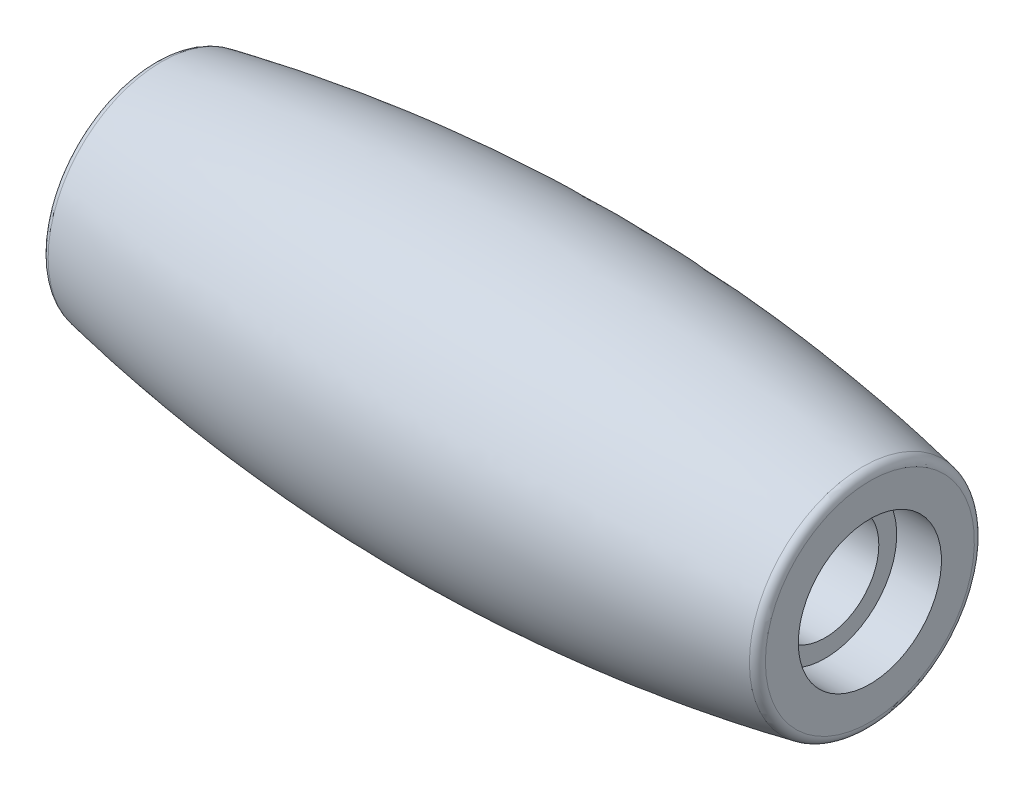
ISO-10303-21;
HEADER;
FILE_DESCRIPTION(('STEP AP214'),'2;1');
FILE_NAME('part.step','',(''),(''),'','','');
FILE_SCHEMA(('AUTOMOTIVE_DESIGN { 1 0 10303 214 1 1 1 1 }'));
ENDSEC;
DATA;
#1=APPLICATION_CONTEXT('core data for automotive mechanical design processes');
#2=APPLICATION_PROTOCOL_DEFINITION('international standard','automotive_design',2000,#1);
#3=PRODUCT_CONTEXT('',#1,'mechanical');
#4=PRODUCT('Part','Part','',(#3));
#5=PRODUCT_RELATED_PRODUCT_CATEGORY('part','',(#4));
#6=PRODUCT_DEFINITION_FORMATION('','',#4);
#7=PRODUCT_DEFINITION_CONTEXT('part definition',#1,'design');
#8=PRODUCT_DEFINITION('design','',#6,#7);
#9=PRODUCT_DEFINITION_SHAPE('','',#8);
#10=(LENGTH_UNIT() NAMED_UNIT(*) SI_UNIT(.MILLI.,.METRE.));
#11=(NAMED_UNIT(*) PLANE_ANGLE_UNIT() SI_UNIT($,.RADIAN.));
#12=(NAMED_UNIT(*) SI_UNIT($,.STERADIAN.) SOLID_ANGLE_UNIT());
#13=UNCERTAINTY_MEASURE_WITH_UNIT(LENGTH_MEASURE(1.E-05),#10,'distance_accuracy_value','');
#14=(GEOMETRIC_REPRESENTATION_CONTEXT(3) GLOBAL_UNCERTAINTY_ASSIGNED_CONTEXT((#13)) GLOBAL_UNIT_ASSIGNED_CONTEXT((#10,
#11,#12)) REPRESENTATION_CONTEXT('',''));
#15=CARTESIAN_POINT('',(0.,0.,0.));
#16=DIRECTION('',(0.,0.,1.));
#17=DIRECTION('',(1.,0.,0.));
#18=AXIS2_PLACEMENT_3D('',#15,#16,#17);
#19=CARTESIAN_POINT('',(-39.1940298507463,0.,12.6611163272422));
#20=CARTESIAN_POINT('',(-39.1940298507463,-12.6611163272422,12.6611163272422));
#21=CARTESIAN_POINT('',(-39.1940298507463,-12.6611163272422,0.));
#22=CARTESIAN_POINT('',(-39.1940298507463,-12.6611163272422,-12.6611163272422));
#23=CARTESIAN_POINT('',(-39.1940298507463,0.,-12.6611163272422));
#24=CARTESIAN_POINT('',(-39.1940298507463,12.6611163272422,-12.6611163272422));
#25=CARTESIAN_POINT('',(-39.1940298507463,12.6611163272422,0.));
#26=CARTESIAN_POINT('',(-39.1940298507463,12.6611163272422,12.6611163272422));
#27=CARTESIAN_POINT('',(-39.1940298507463,0.,12.6611163272422));
#28=CARTESIAN_POINT('',(0.,0.,20.4132525909699));
#29=CARTESIAN_POINT('',(0.,-20.4132525909699,20.4132525909699));
#30=CARTESIAN_POINT('',(0.,-20.4132525909699,0.));
#31=CARTESIAN_POINT('',(0.,-20.4132525909699,-20.4132525909699));
#32=CARTESIAN_POINT('',(0.,0.,-20.4132525909699));
#33=CARTESIAN_POINT('',(0.,20.4132525909699,-20.4132525909699));
#34=CARTESIAN_POINT('',(0.,20.4132525909699,0.));
#35=CARTESIAN_POINT('',(0.,20.4132525909699,20.4132525909699));
#36=CARTESIAN_POINT('',(0.,0.,20.4132525909699));
#37=CARTESIAN_POINT('',(39.1940298507463,0.,12.6611163272422));
#38=CARTESIAN_POINT('',(39.1940298507463,-12.6611163272422,12.6611163272422));
#39=CARTESIAN_POINT('',(39.1940298507463,-12.6611163272422,0.));
#40=CARTESIAN_POINT('',(39.1940298507463,-12.6611163272422,-12.6611163272422));
#41=CARTESIAN_POINT('',(39.1940298507463,0.,-12.6611163272422));
#42=CARTESIAN_POINT('',(39.1940298507463,12.6611163272422,-12.6611163272422));
#43=CARTESIAN_POINT('',(39.1940298507463,12.6611163272422,0.));
#44=CARTESIAN_POINT('',(39.1940298507463,12.6611163272422,12.6611163272422));
#45=CARTESIAN_POINT('',(39.1940298507463,0.,12.6611163272422));
#46=(BOUNDED_SURFACE() B_SPLINE_SURFACE(2,2,((#19,#20,#21,#22,#23,#24,#25,#26,#27),(#28,#29,#30,
#31,#32,#33,#34,#35,#36),(#37,#38,#39,#40,#41,#42,#43,#44,#45)),.UNSPECIFIED.,.F.,.T.,
.F.) B_SPLINE_SURFACE_WITH_KNOTS((3,3),(3,2,2,2,3),(-0.195268409757262,0.195268409757262),
(-3.14159265358979,-1.5707963267949,0.,1.5707963267949,3.14159265358979),
.UNSPECIFIED.) GEOMETRIC_REPRESENTATION_ITEM() RATIONAL_B_SPLINE_SURFACE(((1.,0.707106781186548,
1.,0.707106781186548,1.,0.707106781186548,1.,0.707106781186548,1.),(0.980995625382391,
0.693668659022227,0.980995625382391,0.693668659022227,0.980995625382391,0.693668659022227,
0.980995625382391,0.693668659022227,0.980995625382391),(1.,0.707106781186548,1.,
0.707106781186548,1.,0.707106781186548,1.,0.707106781186548,1.))) REPRESENTATION_ITEM('') SURFACE());
#47=CARTESIAN_POINT('',(39.1940298507463,0.,0.));
#48=DIRECTION('',(-1.,0.,0.));
#49=DIRECTION('',(0.,-1.,0.));
#50=AXIS2_PLACEMENT_3D('',#47,#48,#49);
#51=CIRCLE('',#50,12.6611163272422);
#52=CARTESIAN_POINT('',(39.1940298507463,12.6611163272422,0.));
#53=VERTEX_POINT('',#52);
#54=CARTESIAN_POINT('',(39.1940298507463,0.,12.6611163272422));
#55=VERTEX_POINT('',#54);
#56=EDGE_CURVE('E124',#53,#55,#51,.T.);
#57=CARTESIAN_POINT('',(0.,0.,-185.5));
#58=DIRECTION('',(0.,-1.,0.));
#59=DIRECTION('',(0.,0.,1.));
#60=AXIS2_PLACEMENT_3D('',#57,#58,#59);
#61=CIRCLE('',#60,202.);
#62=CARTESIAN_POINT('',(-39.1940298507463,0.,12.6611163272422));
#63=VERTEX_POINT('',#62);
#64=EDGE_CURVE('E11',#55,#63,#61,.T.);
#65=CARTESIAN_POINT('',(-39.1940298507463,0.,0.));
#66=DIRECTION('',(-1.,0.,0.));
#67=DIRECTION('',(0.,-1.,0.));
#68=AXIS2_PLACEMENT_3D('',#65,#66,#67);
#69=CIRCLE('',#68,12.6611163272422);
#70=CARTESIAN_POINT('',(-39.1940298507463,12.6611163272422,0.));
#71=VERTEX_POINT('',#70);
#72=EDGE_CURVE('E159',#71,#63,#69,.T.);
#73=CARTESIAN_POINT('',(-39.1940298507463,0.,0.));
#74=DIRECTION('',(-1.,0.,0.));
#75=DIRECTION('',(0.,-1.,0.));
#76=AXIS2_PLACEMENT_3D('',#73,#74,#75);
#77=CIRCLE('',#76,12.6611163272422);
#78=EDGE_CURVE('E30',#63,#71,#77,.T.);
#79=CARTESIAN_POINT('',(39.1940298507463,0.,0.));
#80=DIRECTION('',(-1.,0.,0.));
#81=DIRECTION('',(0.,-1.,0.));
#82=AXIS2_PLACEMENT_3D('',#79,#80,#81);
#83=CIRCLE('',#82,12.6611163272422);
#84=EDGE_CURVE('E80',#55,#53,#83,.T.);
#85=ORIENTED_EDGE('',*,*,#56,.T.);
#86=ORIENTED_EDGE('',*,*,#64,.T.);
#87=ORIENTED_EDGE('',*,*,#72,.F.);
#88=ORIENTED_EDGE('',*,*,#78,.F.);
#89=ORIENTED_EDGE('',*,*,#64,.F.);
#90=ORIENTED_EDGE('',*,*,#84,.T.);
#91=EDGE_LOOP('',(#85,#86,#87,#88,#89,#90));
#92=FACE_BOUND('',#91,.T.);
#93=ADVANCED_FACE('F19',(#92),#46,.F.);
#94=CARTESIAN_POINT('',(-40.,12.5,0.));
#95=DIRECTION('',(-1.,0.,0.));
#96=DIRECTION('',(0.,0.,1.));
#97=AXIS2_PLACEMENT_3D('',#94,#95,#96);
#98=PLANE('',#97);
#99=CARTESIAN_POINT('',(-40.,0.,0.));
#100=DIRECTION('',(1.,0.,0.));
#101=DIRECTION('',(0.,0.,-1.));
#102=AXIS2_PLACEMENT_3D('',#99,#100,#101);
#103=CIRCLE('',#102,8.);
#104=CARTESIAN_POINT('',(-40.,0.,8.));
#105=VERTEX_POINT('',#104);
#106=EDGE_CURVE('E107',#105,#105,#103,.T.);
#107=ORIENTED_EDGE('',*,*,#106,.T.);
#108=EDGE_LOOP('',(#107));
#109=FACE_BOUND('',#108,.T.);
#110=CARTESIAN_POINT('',(-40.,0.,0.));
#111=DIRECTION('',(1.,0.,0.));
#112=DIRECTION('',(0.,-1.,0.));
#113=AXIS2_PLACEMENT_3D('',#110,#111,#112);
#114=CIRCLE('',#113,11.6801207018598);
#115=CARTESIAN_POINT('',(-40.,11.6801207018598,0.));
#116=VERTEX_POINT('',#115);
#117=CARTESIAN_POINT('',(-40.,0.,11.6801207018598));
#118=VERTEX_POINT('',#117);
#119=EDGE_CURVE('E43',#116,#118,#114,.T.);
#120=ORIENTED_EDGE('',*,*,#119,.F.);
#121=CARTESIAN_POINT('',(-40.,0.,0.));
#122=DIRECTION('',(1.,0.,0.));
#123=DIRECTION('',(0.,-1.,0.));
#124=AXIS2_PLACEMENT_3D('',#121,#122,#123);
#125=CIRCLE('',#124,11.6801207018598);
#126=EDGE_CURVE('E166',#118,#116,#125,.T.);
#127=ORIENTED_EDGE('',*,*,#126,.F.);
#128=EDGE_LOOP('',(#120,#127));
#129=FACE_BOUND('',#128,.T.);
#130=ADVANCED_FACE('F111',(#109,#129),#98,.T.);
#131=CARTESIAN_POINT('',(-39.,0.,0.));
#132=DIRECTION('',(1.,0.,0.));
#133=DIRECTION('',(0.,0.,-1.));
#134=AXIS2_PLACEMENT_3D('',#131,#132,#133);
#135=TOROIDAL_SURFACE('',#134,11.6801207018598,1.);
#136=ORIENTED_EDGE('',*,*,#72,.T.);
#137=CARTESIAN_POINT('',(-39.,0.,11.6801207018598));
#138=DIRECTION('',(0.,-1.,0.));
#139=DIRECTION('',(0.,0.,1.));
#140=AXIS2_PLACEMENT_3D('',#137,#138,#139);
#141=CIRCLE('',#140,1.);
#142=EDGE_CURVE('E122',#63,#118,#141,.T.);
#143=ORIENTED_EDGE('',*,*,#142,.T.);
#144=ORIENTED_EDGE('',*,*,#126,.T.);
#145=ORIENTED_EDGE('',*,*,#119,.T.);
#146=ORIENTED_EDGE('',*,*,#142,.F.);
#147=ORIENTED_EDGE('',*,*,#78,.T.);
#148=EDGE_LOOP('',(#136,#143,#144,#145,#146,#147));
#149=FACE_BOUND('',#148,.T.);
#150=ADVANCED_FACE('F196',(#149),#135,.T.);
#151=CARTESIAN_POINT('',(-35.,0.,0.));
#152=DIRECTION('',(1.,0.,0.));
#153=DIRECTION('',(0.,1.,0.));
#154=AXIS2_PLACEMENT_3D('',#151,#152,#153);
#155=PLANE('',#154);
#156=CARTESIAN_POINT('',(-35.,0.,0.));
#157=DIRECTION('',(1.,0.,0.));
#158=DIRECTION('',(0.,0.,1.));
#159=AXIS2_PLACEMENT_3D('',#156,#157,#158);
#160=CIRCLE('',#159,6.);
#161=CARTESIAN_POINT('',(-35.,0.,-6.));
#162=VERTEX_POINT('',#161);
#163=EDGE_CURVE('E23',#162,#162,#160,.T.);
#164=ORIENTED_EDGE('',*,*,#163,.T.);
#165=EDGE_LOOP('',(#164));
#166=FACE_BOUND('',#165,.T.);
#167=CARTESIAN_POINT('',(-35.,0.,0.));
#168=DIRECTION('',(1.,0.,0.));
#169=DIRECTION('',(0.,0.,-1.));
#170=AXIS2_PLACEMENT_3D('',#167,#168,#169);
#171=CIRCLE('',#170,8.);
#172=CARTESIAN_POINT('',(-35.,0.,8.));
#173=VERTEX_POINT('',#172);
#174=EDGE_CURVE('E98',#173,#173,#171,.T.);
#175=ORIENTED_EDGE('',*,*,#174,.F.);
#176=EDGE_LOOP('',(#175));
#177=FACE_BOUND('',#176,.T.);
#178=ADVANCED_FACE('F21',(#166,#177),#155,.F.);
#179=CARTESIAN_POINT('',(-40.,0.,0.));
#180=DIRECTION('',(1.,0.,0.));
#181=DIRECTION('',(0.,0.,-1.));
#182=AXIS2_PLACEMENT_3D('',#179,#180,#181);
#183=CYLINDRICAL_SURFACE('',#182,8.);
#184=ORIENTED_EDGE('',*,*,#106,.F.);
#185=DIRECTION('',(1.,0.,0.));
#186=VECTOR('',#185,1.);
#187=CARTESIAN_POINT('',(-40.,0.,8.));
#188=LINE('',#187,#186);
#189=EDGE_CURVE('E104',#105,#173,#188,.T.);
#190=ORIENTED_EDGE('',*,*,#189,.T.);
#191=ORIENTED_EDGE('',*,*,#174,.T.);
#192=ORIENTED_EDGE('',*,*,#189,.F.);
#193=EDGE_LOOP('',(#184,#190,#191,#192));
#194=FACE_BOUND('',#193,.T.);
#195=ADVANCED_FACE('F106',(#194),#183,.F.);
#196=CARTESIAN_POINT('',(40.,12.5,0.));
#197=DIRECTION('',(-1.,0.,0.));
#198=DIRECTION('',(0.,0.,1.));
#199=AXIS2_PLACEMENT_3D('',#196,#197,#198);
#200=PLANE('',#199);
#201=CARTESIAN_POINT('',(40.,0.,0.));
#202=DIRECTION('',(1.,0.,0.));
#203=DIRECTION('',(0.,0.,-1.));
#204=AXIS2_PLACEMENT_3D('',#201,#202,#203);
#205=CIRCLE('',#204,8.);
#206=CARTESIAN_POINT('',(40.,0.,8.));
#207=VERTEX_POINT('',#206);
#208=EDGE_CURVE('E141',#207,#207,#205,.T.);
#209=ORIENTED_EDGE('',*,*,#208,.F.);
#210=EDGE_LOOP('',(#209));
#211=FACE_BOUND('',#210,.T.);
#212=CARTESIAN_POINT('',(40.,0.,0.));
#213=DIRECTION('',(1.,0.,0.));
#214=DIRECTION('',(0.,-1.,0.));
#215=AXIS2_PLACEMENT_3D('',#212,#213,#214);
#216=CIRCLE('',#215,11.6801207018598);
#217=CARTESIAN_POINT('',(40.,11.6801207018598,0.));
#218=VERTEX_POINT('',#217);
#219=CARTESIAN_POINT('',(40.,0.,11.6801207018598));
#220=VERTEX_POINT('',#219);
#221=EDGE_CURVE('E119',#218,#220,#216,.T.);
#222=ORIENTED_EDGE('',*,*,#221,.T.);
#223=CARTESIAN_POINT('',(40.,0.,0.));
#224=DIRECTION('',(1.,0.,0.));
#225=DIRECTION('',(0.,-1.,0.));
#226=AXIS2_PLACEMENT_3D('',#223,#224,#225);
#227=CIRCLE('',#226,11.6801207018598);
#228=EDGE_CURVE('E113',#220,#218,#227,.T.);
#229=ORIENTED_EDGE('',*,*,#228,.T.);
#230=EDGE_LOOP('',(#222,#229));
#231=FACE_BOUND('',#230,.T.);
#232=ADVANCED_FACE('F220',(#211,#231),#200,.F.);
#233=CARTESIAN_POINT('',(39.,0.,0.));
#234=DIRECTION('',(-1.,0.,0.));
#235=DIRECTION('',(0.,0.,-1.));
#236=AXIS2_PLACEMENT_3D('',#233,#234,#235);
#237=TOROIDAL_SURFACE('',#236,11.6801207018598,1.);
#238=ORIENTED_EDGE('',*,*,#56,.F.);
#239=ORIENTED_EDGE('',*,*,#84,.F.);
#240=CARTESIAN_POINT('',(39.,0.,11.6801207018598));
#241=DIRECTION('',(0.,1.,0.));
#242=DIRECTION('',(0.,0.,1.));
#243=AXIS2_PLACEMENT_3D('',#240,#241,#242);
#244=CIRCLE('',#243,1.);
#245=EDGE_CURVE('E131',#55,#220,#244,.T.);
#246=ORIENTED_EDGE('',*,*,#245,.T.);
#247=ORIENTED_EDGE('',*,*,#221,.F.);
#248=ORIENTED_EDGE('',*,*,#228,.F.);
#249=ORIENTED_EDGE('',*,*,#245,.F.);
#250=EDGE_LOOP('',(#238,#239,#246,#247,#248,#249));
#251=FACE_BOUND('',#250,.T.);
#252=ADVANCED_FACE('F211',(#251),#237,.T.);
#253=CARTESIAN_POINT('',(35.,0.,0.));
#254=DIRECTION('',(1.,0.,0.));
#255=DIRECTION('',(0.,1.,0.));
#256=AXIS2_PLACEMENT_3D('',#253,#254,#255);
#257=PLANE('',#256);
#258=CARTESIAN_POINT('',(35.,0.,0.));
#259=DIRECTION('',(-1.,0.,0.));
#260=DIRECTION('',(0.,0.,1.));
#261=AXIS2_PLACEMENT_3D('',#258,#259,#260);
#262=CIRCLE('',#261,6.);
#263=CARTESIAN_POINT('',(35.,0.,-6.));
#264=VERTEX_POINT('',#263);
#265=EDGE_CURVE('E170',#264,#264,#262,.T.);
#266=ORIENTED_EDGE('',*,*,#265,.T.);
#267=EDGE_LOOP('',(#266));
#268=FACE_BOUND('',#267,.T.);
#269=CARTESIAN_POINT('',(35.,0.,0.));
#270=DIRECTION('',(1.,0.,0.));
#271=DIRECTION('',(0.,0.,-1.));
#272=AXIS2_PLACEMENT_3D('',#269,#270,#271);
#273=CIRCLE('',#272,8.);
#274=CARTESIAN_POINT('',(35.,0.,8.));
#275=VERTEX_POINT('',#274);
#276=EDGE_CURVE('E126',#275,#275,#273,.T.);
#277=ORIENTED_EDGE('',*,*,#276,.T.);
#278=EDGE_LOOP('',(#277));
#279=FACE_BOUND('',#278,.T.);
#280=ADVANCED_FACE('F219',(#268,#279),#257,.T.);
#281=CARTESIAN_POINT('',(40.,0.,0.));
#282=DIRECTION('',(1.,0.,0.));
#283=DIRECTION('',(0.,0.,-1.));
#284=AXIS2_PLACEMENT_3D('',#281,#282,#283);
#285=CYLINDRICAL_SURFACE('',#284,8.);
#286=ORIENTED_EDGE('',*,*,#208,.T.);
#287=DIRECTION('',(-1.,0.,0.));
#288=VECTOR('',#287,1.);
#289=CARTESIAN_POINT('',(40.,0.,8.));
#290=LINE('',#289,#288);
#291=EDGE_CURVE('E133',#207,#275,#290,.T.);
#292=ORIENTED_EDGE('',*,*,#291,.T.);
#293=ORIENTED_EDGE('',*,*,#276,.F.);
#294=ORIENTED_EDGE('',*,*,#291,.F.);
#295=EDGE_LOOP('',(#286,#292,#293,#294));
#296=FACE_BOUND('',#295,.T.);
#297=ADVANCED_FACE('F223',(#296),#285,.F.);
#298=CARTESIAN_POINT('',(35.,0.,0.));
#299=DIRECTION('',(-1.,0.,0.));
#300=DIRECTION('',(0.,0.,1.));
#301=AXIS2_PLACEMENT_3D('',#298,#299,#300);
#302=CYLINDRICAL_SURFACE('',#301,6.);
#303=ORIENTED_EDGE('',*,*,#265,.F.);
#304=DIRECTION('',(-1.,0.,0.));
#305=VECTOR('',#304,1.);
#306=CARTESIAN_POINT('',(35.,0.,-6.));
#307=LINE('',#306,#305);
#308=EDGE_CURVE('E167',#264,#162,#307,.T.);
#309=ORIENTED_EDGE('',*,*,#308,.T.);
#310=ORIENTED_EDGE('',*,*,#163,.F.);
#311=ORIENTED_EDGE('',*,*,#308,.F.);
#312=EDGE_LOOP('',(#303,#309,#310,#311));
#313=FACE_BOUND('',#312,.T.);
#314=ADVANCED_FACE('F225',(#313),#302,.F.);
#315=CLOSED_SHELL('',(#93,#130,#150,#178,#195,#232,#252,#280,#297,#314));
#316=MANIFOLD_SOLID_BREP('B1',#315);
#317=ADVANCED_BREP_SHAPE_REPRESENTATION('',(#18,#316),#14);
#318=SHAPE_DEFINITION_REPRESENTATION(#9,#317);
ENDSEC;
END-ISO-10303-21;
